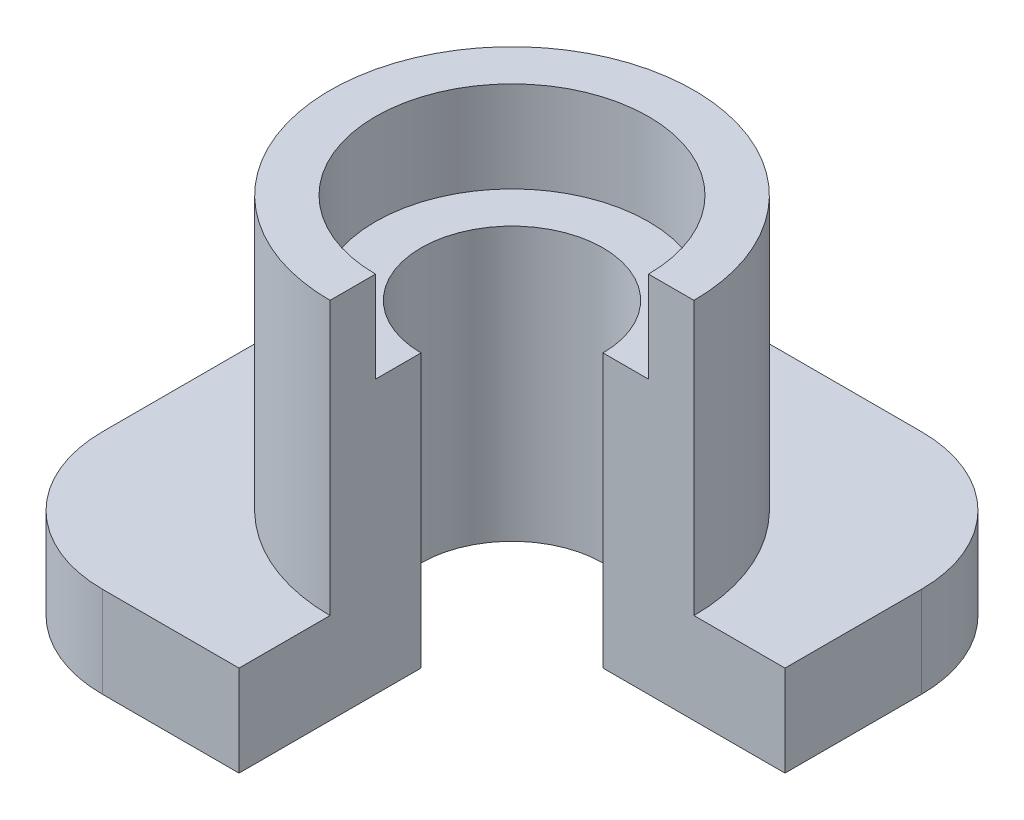
ISO-10303-21;
HEADER;
FILE_DESCRIPTION(('STEP AP214'),'2;1');
FILE_NAME('part.step','',(''),(''),'','','');
FILE_SCHEMA(('AUTOMOTIVE_DESIGN { 1 0 10303 214 1 1 1 1 }'));
ENDSEC;
DATA;
#1=APPLICATION_CONTEXT('core data for automotive mechanical design processes');
#2=APPLICATION_PROTOCOL_DEFINITION('international standard','automotive_design',2000,#1);
#3=PRODUCT_CONTEXT('',#1,'mechanical');
#4=PRODUCT('Part','Part','',(#3));
#5=PRODUCT_RELATED_PRODUCT_CATEGORY('part','',(#4));
#6=PRODUCT_DEFINITION_FORMATION('','',#4);
#7=PRODUCT_DEFINITION_CONTEXT('part definition',#1,'design');
#8=PRODUCT_DEFINITION('design','',#6,#7);
#9=PRODUCT_DEFINITION_SHAPE('','',#8);
#10=(LENGTH_UNIT() NAMED_UNIT(*) SI_UNIT(.MILLI.,.METRE.));
#11=(NAMED_UNIT(*) PLANE_ANGLE_UNIT() SI_UNIT($,.RADIAN.));
#12=(NAMED_UNIT(*) SI_UNIT($,.STERADIAN.) SOLID_ANGLE_UNIT());
#13=UNCERTAINTY_MEASURE_WITH_UNIT(LENGTH_MEASURE(1.E-05),#10,'distance_accuracy_value','');
#14=(GEOMETRIC_REPRESENTATION_CONTEXT(3) GLOBAL_UNCERTAINTY_ASSIGNED_CONTEXT((#13)) GLOBAL_UNIT_ASSIGNED_CONTEXT((#10,
#11,#12)) REPRESENTATION_CONTEXT('',''));
#15=CARTESIAN_POINT('',(0.,0.,0.));
#16=DIRECTION('',(0.,0.,1.));
#17=DIRECTION('',(1.,0.,0.));
#18=AXIS2_PLACEMENT_3D('',#15,#16,#17);
#19=CARTESIAN_POINT('',(30.,20.,-30.));
#20=DIRECTION('',(0.,-1.,0.));
#21=DIRECTION('',(0.,0.,-1.));
#22=AXIS2_PLACEMENT_3D('',#19,#20,#21);
#23=PLANE('',#22);
#24=DIRECTION('',(1.,0.,0.));
#25=VECTOR('',#24,1.);
#26=CARTESIAN_POINT('',(-29.9999999999998,20.,60.));
#27=LINE('',#26,#25);
#28=CARTESIAN_POINT('',(-29.9999999999998,20.,60.));
#29=VERTEX_POINT('',#28);
#30=CARTESIAN_POINT('',(0.,20.,60.));
#31=VERTEX_POINT('',#30);
#32=EDGE_CURVE('E219',#29,#31,#27,.T.);
#33=ORIENTED_EDGE('',*,*,#32,.T.);
#34=DIRECTION('',(0.,0.,-1.));
#35=VECTOR('',#34,1.);
#36=CARTESIAN_POINT('',(0.,20.,-30.));
#37=LINE('',#36,#35);
#38=CARTESIAN_POINT('',(0.,20.,40.));
#39=VERTEX_POINT('',#38);
#40=EDGE_CURVE('E136',#31,#39,#37,.T.);
#41=ORIENTED_EDGE('',*,*,#40,.T.);
#42=CARTESIAN_POINT('',(0.,20.,0.));
#43=DIRECTION('',(0.,-1.,0.));
#44=DIRECTION('',(0.,0.,-1.));
#45=AXIS2_PLACEMENT_3D('',#42,#43,#44);
#46=CIRCLE('',#45,40.);
#47=CARTESIAN_POINT('',(40.,20.,0.));
#48=VERTEX_POINT('',#47);
#49=EDGE_CURVE('E185',#48,#39,#46,.F.);
#50=ORIENTED_EDGE('',*,*,#49,.F.);
#51=DIRECTION('',(1.,0.,0.));
#52=VECTOR('',#51,1.);
#53=CARTESIAN_POINT('',(30.,20.,0.));
#54=LINE('',#53,#52);
#55=CARTESIAN_POINT('',(60.,20.,0.));
#56=VERTEX_POINT('',#55);
#57=EDGE_CURVE('E267',#48,#56,#54,.T.);
#58=ORIENTED_EDGE('',*,*,#57,.T.);
#59=DIRECTION('',(0.,0.,-1.));
#60=VECTOR('',#59,1.);
#61=CARTESIAN_POINT('',(60.,20.,-29.9999999999998));
#62=LINE('',#61,#60);
#63=CARTESIAN_POINT('',(60.,20.,-29.9999999999998));
#64=VERTEX_POINT('',#63);
#65=EDGE_CURVE('E171',#56,#64,#62,.T.);
#66=ORIENTED_EDGE('',*,*,#65,.T.);
#67=CARTESIAN_POINT('',(30.,20.,-30.));
#68=DIRECTION('',(0.,1.,0.));
#69=DIRECTION('',(0.,0.,-1.));
#70=AXIS2_PLACEMENT_3D('',#67,#68,#69);
#71=CIRCLE('',#70,30.);
#72=CARTESIAN_POINT('',(29.9999999999998,20.,-60.));
#73=VERTEX_POINT('',#72);
#74=EDGE_CURVE('E162',#64,#73,#71,.T.);
#75=ORIENTED_EDGE('',*,*,#74,.T.);
#76=DIRECTION('',(-1.,0.,0.));
#77=VECTOR('',#76,1.);
#78=CARTESIAN_POINT('',(-29.9999999999998,20.,-60.));
#79=LINE('',#78,#77);
#80=CARTESIAN_POINT('',(-29.9999999999998,20.,-60.));
#81=VERTEX_POINT('',#80);
#82=EDGE_CURVE('E211',#73,#81,#79,.T.);
#83=ORIENTED_EDGE('',*,*,#82,.T.);
#84=CARTESIAN_POINT('',(-30.,20.,-30.));
#85=DIRECTION('',(0.,1.,0.));
#86=DIRECTION('',(0.,0.,1.));
#87=AXIS2_PLACEMENT_3D('',#84,#85,#86);
#88=CIRCLE('',#87,30.);
#89=CARTESIAN_POINT('',(-60.,20.,-29.9999999999998));
#90=VERTEX_POINT('',#89);
#91=EDGE_CURVE('E213',#81,#90,#88,.T.);
#92=ORIENTED_EDGE('',*,*,#91,.T.);
#93=DIRECTION('',(0.,0.,1.));
#94=VECTOR('',#93,1.);
#95=CARTESIAN_POINT('',(-60.,20.,-29.9999999999998));
#96=LINE('',#95,#94);
#97=CARTESIAN_POINT('',(-60.,20.,29.9999999999998));
#98=VERTEX_POINT('',#97);
#99=EDGE_CURVE('E215',#90,#98,#96,.T.);
#100=ORIENTED_EDGE('',*,*,#99,.T.);
#101=CARTESIAN_POINT('',(-30.,20.,30.));
#102=DIRECTION('',(0.,1.,0.));
#103=DIRECTION('',(0.,0.,-1.));
#104=AXIS2_PLACEMENT_3D('',#101,#102,#103);
#105=CIRCLE('',#104,30.);
#106=EDGE_CURVE('E217',#98,#29,#105,.T.);
#107=ORIENTED_EDGE('',*,*,#106,.T.);
#108=EDGE_LOOP('',(#33,#41,#50,#58,#66,#75,#83,#92,#100,#107));
#109=FACE_BOUND('',#108,.T.);
#110=ADVANCED_FACE('F35',(#109),#23,.F.);
#111=CARTESIAN_POINT('',(30.,20.,-30.));
#112=DIRECTION('',(0.,-1.,0.));
#113=DIRECTION('',(0.,0.,-1.));
#114=AXIS2_PLACEMENT_3D('',#111,#112,#113);
#115=CYLINDRICAL_SURFACE('',#114,30.);
#116=CARTESIAN_POINT('',(30.,0.,-30.));
#117=DIRECTION('',(0.,1.,0.));
#118=DIRECTION('',(0.,0.,-1.));
#119=AXIS2_PLACEMENT_3D('',#116,#117,#118);
#120=CIRCLE('',#119,30.);
#121=CARTESIAN_POINT('',(60.,0.,-29.9999999999998));
#122=VERTEX_POINT('',#121);
#123=CARTESIAN_POINT('',(29.9999999999998,0.,-60.));
#124=VERTEX_POINT('',#123);
#125=EDGE_CURVE('E208',#122,#124,#120,.T.);
#126=ORIENTED_EDGE('',*,*,#125,.T.);
#127=DIRECTION('',(0.,-1.,0.));
#128=VECTOR('',#127,1.);
#129=CARTESIAN_POINT('',(29.9999999999998,20.,-60.));
#130=LINE('',#129,#128);
#131=EDGE_CURVE('E182',#73,#124,#130,.T.);
#132=ORIENTED_EDGE('',*,*,#131,.F.);
#133=ORIENTED_EDGE('',*,*,#74,.F.);
#134=DIRECTION('',(0.,-1.,0.));
#135=VECTOR('',#134,1.);
#136=CARTESIAN_POINT('',(60.,20.,-29.9999999999998));
#137=LINE('',#136,#135);
#138=EDGE_CURVE('E168',#64,#122,#137,.T.);
#139=ORIENTED_EDGE('',*,*,#138,.T.);
#140=EDGE_LOOP('',(#126,#132,#133,#139));
#141=FACE_BOUND('',#140,.T.);
#142=ADVANCED_FACE('F37',(#141),#115,.T.);
#143=CARTESIAN_POINT('',(-29.9999999999998,20.,-60.));
#144=DIRECTION('',(0.,0.,1.));
#145=DIRECTION('',(1.,0.,0.));
#146=AXIS2_PLACEMENT_3D('',#143,#144,#145);
#147=PLANE('',#146);
#148=DIRECTION('',(-1.,0.,0.));
#149=VECTOR('',#148,1.);
#150=CARTESIAN_POINT('',(-29.9999999999998,0.,-60.));
#151=LINE('',#150,#149);
#152=CARTESIAN_POINT('',(-29.9999999999998,0.,-60.));
#153=VERTEX_POINT('',#152);
#154=EDGE_CURVE('E224',#124,#153,#151,.T.);
#155=ORIENTED_EDGE('',*,*,#154,.T.);
#156=DIRECTION('',(0.,-1.,0.));
#157=VECTOR('',#156,1.);
#158=CARTESIAN_POINT('',(-29.9999999999998,20.,-60.));
#159=LINE('',#158,#157);
#160=EDGE_CURVE('E179',#81,#153,#159,.T.);
#161=ORIENTED_EDGE('',*,*,#160,.F.);
#162=ORIENTED_EDGE('',*,*,#82,.F.);
#163=ORIENTED_EDGE('',*,*,#131,.T.);
#164=EDGE_LOOP('',(#155,#161,#162,#163));
#165=FACE_BOUND('',#164,.T.);
#166=ADVANCED_FACE('F246',(#165),#147,.F.);
#167=CARTESIAN_POINT('',(-30.,20.,-30.));
#168=DIRECTION('',(0.,-1.,0.));
#169=DIRECTION('',(0.,0.,-1.));
#170=AXIS2_PLACEMENT_3D('',#167,#168,#169);
#171=CYLINDRICAL_SURFACE('',#170,30.);
#172=CARTESIAN_POINT('',(-30.,0.,-30.));
#173=DIRECTION('',(0.,1.,0.));
#174=DIRECTION('',(0.,0.,1.));
#175=AXIS2_PLACEMENT_3D('',#172,#173,#174);
#176=CIRCLE('',#175,30.);
#177=CARTESIAN_POINT('',(-60.,0.,-29.9999999999998));
#178=VERTEX_POINT('',#177);
#179=EDGE_CURVE('E226',#153,#178,#176,.T.);
#180=ORIENTED_EDGE('',*,*,#179,.T.);
#181=DIRECTION('',(0.,-1.,0.));
#182=VECTOR('',#181,1.);
#183=CARTESIAN_POINT('',(-60.,20.,-29.9999999999998));
#184=LINE('',#183,#182);
#185=EDGE_CURVE('E176',#90,#178,#184,.T.);
#186=ORIENTED_EDGE('',*,*,#185,.F.);
#187=ORIENTED_EDGE('',*,*,#91,.F.);
#188=ORIENTED_EDGE('',*,*,#160,.T.);
#189=EDGE_LOOP('',(#180,#186,#187,#188));
#190=FACE_BOUND('',#189,.T.);
#191=ADVANCED_FACE('F241',(#190),#171,.T.);
#192=CARTESIAN_POINT('',(-60.,20.,-29.9999999999998));
#193=DIRECTION('',(1.,0.,0.));
#194=DIRECTION('',(0.,0.,-1.));
#195=AXIS2_PLACEMENT_3D('',#192,#193,#194);
#196=PLANE('',#195);
#197=DIRECTION('',(0.,0.,1.));
#198=VECTOR('',#197,1.);
#199=CARTESIAN_POINT('',(-60.,0.,-29.9999999999998));
#200=LINE('',#199,#198);
#201=CARTESIAN_POINT('',(-60.,0.,29.9999999999998));
#202=VERTEX_POINT('',#201);
#203=EDGE_CURVE('E164',#178,#202,#200,.T.);
#204=ORIENTED_EDGE('',*,*,#203,.T.);
#205=DIRECTION('',(0.,-1.,0.));
#206=VECTOR('',#205,1.);
#207=CARTESIAN_POINT('',(-60.,20.,29.9999999999998));
#208=LINE('',#207,#206);
#209=EDGE_CURVE('E173',#98,#202,#208,.T.);
#210=ORIENTED_EDGE('',*,*,#209,.F.);
#211=ORIENTED_EDGE('',*,*,#99,.F.);
#212=ORIENTED_EDGE('',*,*,#185,.T.);
#213=EDGE_LOOP('',(#204,#210,#211,#212));
#214=FACE_BOUND('',#213,.T.);
#215=ADVANCED_FACE('F230',(#214),#196,.F.);
#216=CARTESIAN_POINT('',(-30.,20.,30.));
#217=DIRECTION('',(0.,-1.,0.));
#218=DIRECTION('',(0.,0.,-1.));
#219=AXIS2_PLACEMENT_3D('',#216,#217,#218);
#220=CYLINDRICAL_SURFACE('',#219,30.);
#221=CARTESIAN_POINT('',(-30.,0.,30.));
#222=DIRECTION('',(0.,1.,0.));
#223=DIRECTION('',(0.,0.,-1.));
#224=AXIS2_PLACEMENT_3D('',#221,#222,#223);
#225=CIRCLE('',#224,30.);
#226=CARTESIAN_POINT('',(-29.9999999999998,0.,60.));
#227=VERTEX_POINT('',#226);
#228=EDGE_CURVE('E160',#202,#227,#225,.T.);
#229=ORIENTED_EDGE('',*,*,#228,.T.);
#230=DIRECTION('',(0.,-1.,0.));
#231=VECTOR('',#230,1.);
#232=CARTESIAN_POINT('',(-29.9999999999998,20.,60.));
#233=LINE('',#232,#231);
#234=EDGE_CURVE('E158',#29,#227,#233,.T.);
#235=ORIENTED_EDGE('',*,*,#234,.F.);
#236=ORIENTED_EDGE('',*,*,#106,.F.);
#237=ORIENTED_EDGE('',*,*,#209,.T.);
#238=EDGE_LOOP('',(#229,#235,#236,#237));
#239=FACE_BOUND('',#238,.T.);
#240=ADVANCED_FACE('F236',(#239),#220,.T.);
#241=CARTESIAN_POINT('',(-29.9999999999998,20.,60.));
#242=DIRECTION('',(0.,0.,-1.));
#243=DIRECTION('',(-1.,0.,0.));
#244=AXIS2_PLACEMENT_3D('',#241,#242,#243);
#245=PLANE('',#244);
#246=DIRECTION('',(1.,0.,0.));
#247=VECTOR('',#246,1.);
#248=CARTESIAN_POINT('',(-29.9999999999998,0.,60.));
#249=LINE('',#248,#247);
#250=CARTESIAN_POINT('',(0.,0.,60.));
#251=VERTEX_POINT('',#250);
#252=EDGE_CURVE('E148',#227,#251,#249,.T.);
#253=ORIENTED_EDGE('',*,*,#252,.T.);
#254=DIRECTION('',(0.,1.,0.));
#255=VECTOR('',#254,1.);
#256=CARTESIAN_POINT('',(0.,20.,60.));
#257=LINE('',#256,#255);
#258=EDGE_CURVE('E133',#251,#31,#257,.T.);
#259=ORIENTED_EDGE('',*,*,#258,.T.);
#260=ORIENTED_EDGE('',*,*,#32,.F.);
#261=ORIENTED_EDGE('',*,*,#234,.T.);
#262=EDGE_LOOP('',(#253,#259,#260,#261));
#263=FACE_BOUND('',#262,.T.);
#264=ADVANCED_FACE('F156',(#263),#245,.F.);
#265=CARTESIAN_POINT('',(60.,20.,-29.9999999999998));
#266=DIRECTION('',(-1.,0.,0.));
#267=DIRECTION('',(0.,0.,1.));
#268=AXIS2_PLACEMENT_3D('',#265,#266,#267);
#269=PLANE('',#268);
#270=ORIENTED_EDGE('',*,*,#65,.F.);
#271=DIRECTION('',(0.,-1.,0.));
#272=VECTOR('',#271,1.);
#273=CARTESIAN_POINT('',(60.,20.,0.));
#274=LINE('',#273,#272);
#275=CARTESIAN_POINT('',(60.,0.,0.));
#276=VERTEX_POINT('',#275);
#277=EDGE_CURVE('E254',#56,#276,#274,.T.);
#278=ORIENTED_EDGE('',*,*,#277,.T.);
#279=DIRECTION('',(0.,0.,-1.));
#280=VECTOR('',#279,1.);
#281=CARTESIAN_POINT('',(60.,0.,-29.9999999999998));
#282=LINE('',#281,#280);
#283=EDGE_CURVE('E159',#276,#122,#282,.T.);
#284=ORIENTED_EDGE('',*,*,#283,.T.);
#285=ORIENTED_EDGE('',*,*,#138,.F.);
#286=EDGE_LOOP('',(#270,#278,#284,#285));
#287=FACE_BOUND('',#286,.T.);
#288=ADVANCED_FACE('F252',(#287),#269,.F.);
#289=CARTESIAN_POINT('',(30.,0.,-30.));
#290=DIRECTION('',(0.,-1.,0.));
#291=DIRECTION('',(0.,0.,-1.));
#292=AXIS2_PLACEMENT_3D('',#289,#290,#291);
#293=PLANE('',#292);
#294=DIRECTION('',(0.,0.,1.));
#295=VECTOR('',#294,1.);
#296=CARTESIAN_POINT('',(0.,0.,0.));
#297=LINE('',#296,#295);
#298=CARTESIAN_POINT('',(0.,0.,20.));
#299=VERTEX_POINT('',#298);
#300=EDGE_CURVE('E58',#299,#251,#297,.T.);
#301=ORIENTED_EDGE('',*,*,#300,.T.);
#302=ORIENTED_EDGE('',*,*,#252,.F.);
#303=ORIENTED_EDGE('',*,*,#228,.F.);
#304=ORIENTED_EDGE('',*,*,#203,.F.);
#305=ORIENTED_EDGE('',*,*,#179,.F.);
#306=ORIENTED_EDGE('',*,*,#154,.F.);
#307=ORIENTED_EDGE('',*,*,#125,.F.);
#308=ORIENTED_EDGE('',*,*,#283,.F.);
#309=DIRECTION('',(-1.,0.,0.));
#310=VECTOR('',#309,1.);
#311=CARTESIAN_POINT('',(0.,0.,0.));
#312=LINE('',#311,#310);
#313=CARTESIAN_POINT('',(20.,0.,0.));
#314=VERTEX_POINT('',#313);
#315=EDGE_CURVE('E152',#276,#314,#312,.T.);
#316=ORIENTED_EDGE('',*,*,#315,.T.);
#317=CARTESIAN_POINT('',(0.,0.,0.));
#318=DIRECTION('',(0.,1.,0.));
#319=DIRECTION('',(0.,0.,1.));
#320=AXIS2_PLACEMENT_3D('',#317,#318,#319);
#321=CIRCLE('',#320,20.);
#322=EDGE_CURVE('E151',#314,#299,#321,.T.);
#323=ORIENTED_EDGE('',*,*,#322,.T.);
#324=EDGE_LOOP('',(#301,#302,#303,#304,#305,#306,#307,#308,#316,#323));
#325=FACE_BOUND('',#324,.T.);
#326=ADVANCED_FACE('F146',(#325),#293,.T.);
#327=CARTESIAN_POINT('',(0.,80.,0.));
#328=DIRECTION('',(0.,-1.,0.));
#329=DIRECTION('',(0.,0.,-1.));
#330=AXIS2_PLACEMENT_3D('',#327,#328,#329);
#331=CYLINDRICAL_SURFACE('',#330,40.);
#332=ORIENTED_EDGE('',*,*,#49,.T.);
#333=DIRECTION('',(0.,-1.,0.));
#334=VECTOR('',#333,1.);
#335=CARTESIAN_POINT('',(0.,80.,40.));
#336=LINE('',#335,#334);
#337=CARTESIAN_POINT('',(0.,80.,40.));
#338=VERTEX_POINT('',#337);
#339=EDGE_CURVE('E275',#39,#338,#336,.F.);
#340=ORIENTED_EDGE('',*,*,#339,.T.);
#341=CARTESIAN_POINT('',(0.,80.,0.));
#342=DIRECTION('',(0.,1.,0.));
#343=DIRECTION('',(0.,0.,1.));
#344=AXIS2_PLACEMENT_3D('',#341,#342,#343);
#345=CIRCLE('',#344,40.);
#346=CARTESIAN_POINT('',(40.,80.,0.));
#347=VERTEX_POINT('',#346);
#348=EDGE_CURVE('E203',#347,#338,#345,.T.);
#349=ORIENTED_EDGE('',*,*,#348,.F.);
#350=DIRECTION('',(0.,-1.,0.));
#351=VECTOR('',#350,1.);
#352=CARTESIAN_POINT('',(40.,80.,0.));
#353=LINE('',#352,#351);
#354=EDGE_CURVE('E264',#347,#48,#353,.T.);
#355=ORIENTED_EDGE('',*,*,#354,.T.);
#356=EDGE_LOOP('',(#332,#340,#349,#355));
#357=FACE_BOUND('',#356,.T.);
#358=ADVANCED_FACE('F280',(#357),#331,.T.);
#359=CARTESIAN_POINT('',(0.,80.,0.));
#360=DIRECTION('',(0.,1.,0.));
#361=DIRECTION('',(0.,0.,1.));
#362=AXIS2_PLACEMENT_3D('',#359,#360,#361);
#363=PLANE('',#362);
#364=DIRECTION('',(0.,0.,1.));
#365=VECTOR('',#364,1.);
#366=CARTESIAN_POINT('',(0.,80.,0.));
#367=LINE('',#366,#365);
#368=CARTESIAN_POINT('',(0.,80.,30.));
#369=VERTEX_POINT('',#368);
#370=EDGE_CURVE('E259',#369,#338,#367,.T.);
#371=ORIENTED_EDGE('',*,*,#370,.F.);
#372=CARTESIAN_POINT('',(0.,80.,0.));
#373=DIRECTION('',(0.,1.,0.));
#374=DIRECTION('',(0.,0.,1.));
#375=AXIS2_PLACEMENT_3D('',#372,#373,#374);
#376=CIRCLE('',#375,30.);
#377=CARTESIAN_POINT('',(30.,80.,0.));
#378=VERTEX_POINT('',#377);
#379=EDGE_CURVE('E198',#378,#369,#376,.T.);
#380=ORIENTED_EDGE('',*,*,#379,.F.);
#381=DIRECTION('',(-1.,0.,0.));
#382=VECTOR('',#381,1.);
#383=CARTESIAN_POINT('',(0.,80.,0.));
#384=LINE('',#383,#382);
#385=EDGE_CURVE('E153',#347,#378,#384,.T.);
#386=ORIENTED_EDGE('',*,*,#385,.F.);
#387=ORIENTED_EDGE('',*,*,#348,.T.);
#388=EDGE_LOOP('',(#371,#380,#386,#387));
#389=FACE_BOUND('',#388,.T.);
#390=ADVANCED_FACE('F287',(#389),#363,.T.);
#391=CARTESIAN_POINT('',(0.,60.,0.));
#392=DIRECTION('',(0.,1.,0.));
#393=DIRECTION('',(0.,0.,1.));
#394=AXIS2_PLACEMENT_3D('',#391,#392,#393);
#395=CYLINDRICAL_SURFACE('',#394,30.);
#396=ORIENTED_EDGE('',*,*,#379,.T.);
#397=DIRECTION('',(0.,1.,0.));
#398=VECTOR('',#397,1.);
#399=CARTESIAN_POINT('',(0.,60.,30.));
#400=LINE('',#399,#398);
#401=CARTESIAN_POINT('',(0.,60.,30.));
#402=VERTEX_POINT('',#401);
#403=EDGE_CURVE('E272',#369,#402,#400,.F.);
#404=ORIENTED_EDGE('',*,*,#403,.T.);
#405=CARTESIAN_POINT('',(0.,60.,0.));
#406=DIRECTION('',(0.,1.,0.));
#407=DIRECTION('',(0.,0.,1.));
#408=AXIS2_PLACEMENT_3D('',#405,#406,#407);
#409=CIRCLE('',#408,30.);
#410=CARTESIAN_POINT('',(30.,60.,0.));
#411=VERTEX_POINT('',#410);
#412=EDGE_CURVE('E201',#411,#402,#409,.T.);
#413=ORIENTED_EDGE('',*,*,#412,.F.);
#414=DIRECTION('',(0.,1.,0.));
#415=VECTOR('',#414,1.);
#416=CARTESIAN_POINT('',(30.,60.,0.));
#417=LINE('',#416,#415);
#418=EDGE_CURVE('E256',#411,#378,#417,.T.);
#419=ORIENTED_EDGE('',*,*,#418,.T.);
#420=EDGE_LOOP('',(#396,#404,#413,#419));
#421=FACE_BOUND('',#420,.T.);
#422=ADVANCED_FACE('F289',(#421),#395,.F.);
#423=CARTESIAN_POINT('',(0.,60.,0.));
#424=DIRECTION('',(0.,1.,0.));
#425=DIRECTION('',(0.,0.,1.));
#426=AXIS2_PLACEMENT_3D('',#423,#424,#425);
#427=PLANE('',#426);
#428=DIRECTION('',(0.,0.,1.));
#429=VECTOR('',#428,1.);
#430=CARTESIAN_POINT('',(0.,60.,0.));
#431=LINE('',#430,#429);
#432=CARTESIAN_POINT('',(0.,60.,20.));
#433=VERTEX_POINT('',#432);
#434=EDGE_CURVE('E196',#433,#402,#431,.T.);
#435=ORIENTED_EDGE('',*,*,#434,.F.);
#436=CARTESIAN_POINT('',(0.,60.,0.));
#437=DIRECTION('',(0.,1.,0.));
#438=DIRECTION('',(0.,0.,1.));
#439=AXIS2_PLACEMENT_3D('',#436,#437,#438);
#440=CIRCLE('',#439,20.);
#441=CARTESIAN_POINT('',(20.,60.,0.));
#442=VERTEX_POINT('',#441);
#443=EDGE_CURVE('E141',#442,#433,#440,.T.);
#444=ORIENTED_EDGE('',*,*,#443,.F.);
#445=DIRECTION('',(-1.,0.,0.));
#446=VECTOR('',#445,1.);
#447=CARTESIAN_POINT('',(0.,60.,0.));
#448=LINE('',#447,#446);
#449=EDGE_CURVE('E50',#411,#442,#448,.T.);
#450=ORIENTED_EDGE('',*,*,#449,.F.);
#451=ORIENTED_EDGE('',*,*,#412,.T.);
#452=EDGE_LOOP('',(#435,#444,#450,#451));
#453=FACE_BOUND('',#452,.T.);
#454=ADVANCED_FACE('F193',(#453),#427,.T.);
#455=CARTESIAN_POINT('',(0.,0.,0.));
#456=DIRECTION('',(0.,1.,0.));
#457=DIRECTION('',(0.,0.,1.));
#458=AXIS2_PLACEMENT_3D('',#455,#456,#457);
#459=CYLINDRICAL_SURFACE('',#458,20.);
#460=ORIENTED_EDGE('',*,*,#443,.T.);
#461=DIRECTION('',(0.,1.,0.));
#462=VECTOR('',#461,1.);
#463=CARTESIAN_POINT('',(0.,0.,20.));
#464=LINE('',#463,#462);
#465=EDGE_CURVE('E11',#433,#299,#464,.F.);
#466=ORIENTED_EDGE('',*,*,#465,.T.);
#467=ORIENTED_EDGE('',*,*,#322,.F.);
#468=DIRECTION('',(0.,1.,0.));
#469=VECTOR('',#468,1.);
#470=CARTESIAN_POINT('',(20.,0.,0.));
#471=LINE('',#470,#469);
#472=EDGE_CURVE('E43',#314,#442,#471,.T.);
#473=ORIENTED_EDGE('',*,*,#472,.T.);
#474=EDGE_LOOP('',(#460,#466,#467,#473));
#475=FACE_BOUND('',#474,.T.);
#476=ADVANCED_FACE('F190',(#475),#459,.F.);
#477=CARTESIAN_POINT('',(0.,0.,0.));
#478=DIRECTION('',(0.,0.,-1.));
#479=DIRECTION('',(-1.,0.,0.));
#480=AXIS2_PLACEMENT_3D('',#477,#478,#479);
#481=PLANE('',#480);
#482=ORIENTED_EDGE('',*,*,#57,.F.);
#483=ORIENTED_EDGE('',*,*,#354,.F.);
#484=ORIENTED_EDGE('',*,*,#385,.T.);
#485=ORIENTED_EDGE('',*,*,#418,.F.);
#486=ORIENTED_EDGE('',*,*,#449,.T.);
#487=ORIENTED_EDGE('',*,*,#472,.F.);
#488=ORIENTED_EDGE('',*,*,#315,.F.);
#489=ORIENTED_EDGE('',*,*,#277,.F.);
#490=EDGE_LOOP('',(#482,#483,#484,#485,#486,#487,#488,#489));
#491=FACE_BOUND('',#490,.T.);
#492=ADVANCED_FACE('F283',(#491),#481,.F.);
#493=CARTESIAN_POINT('',(0.,0.,0.));
#494=DIRECTION('',(-1.,0.,0.));
#495=DIRECTION('',(0.,0.,1.));
#496=AXIS2_PLACEMENT_3D('',#493,#494,#495);
#497=PLANE('',#496);
#498=ORIENTED_EDGE('',*,*,#300,.F.);
#499=ORIENTED_EDGE('',*,*,#465,.F.);
#500=ORIENTED_EDGE('',*,*,#434,.T.);
#501=ORIENTED_EDGE('',*,*,#403,.F.);
#502=ORIENTED_EDGE('',*,*,#370,.T.);
#503=ORIENTED_EDGE('',*,*,#339,.F.);
#504=ORIENTED_EDGE('',*,*,#40,.F.);
#505=ORIENTED_EDGE('',*,*,#258,.F.);
#506=EDGE_LOOP('',(#498,#499,#500,#501,#502,#503,#504,#505));
#507=FACE_BOUND('',#506,.T.);
#508=ADVANCED_FACE('F134',(#507),#497,.F.);
#509=CLOSED_SHELL('',(#110,#142,#166,#191,#215,#240,#264,#288,#326,#358,#390,#422,#454,#476,
#492,#508));
#510=MANIFOLD_SOLID_BREP('B2',#509);
#511=ADVANCED_BREP_SHAPE_REPRESENTATION('',(#18,#510),#14);
#512=SHAPE_DEFINITION_REPRESENTATION(#9,#511);
ENDSEC;
END-ISO-10303-21;
